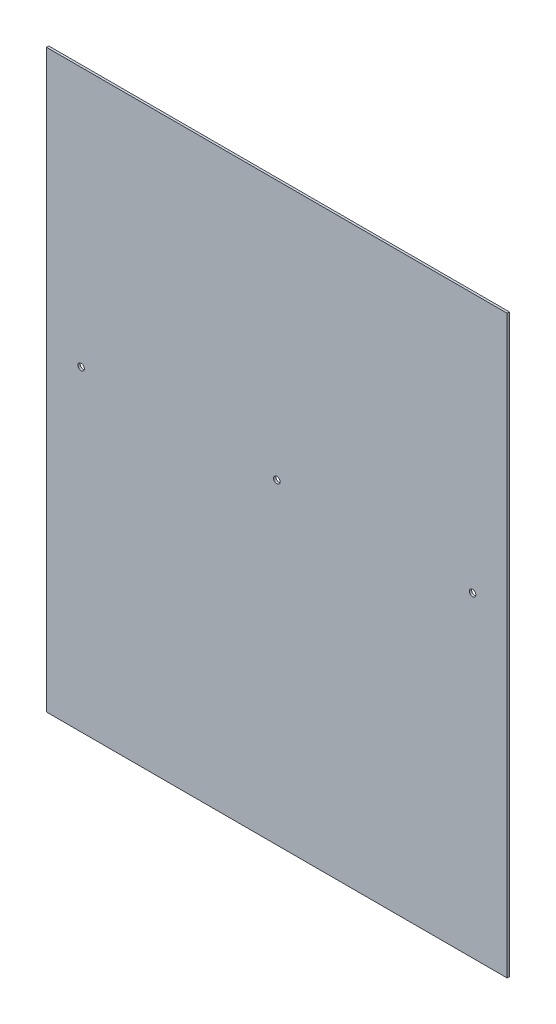
ISO-10303-21;
HEADER;
FILE_DESCRIPTION(('STEP AP214'),'2;1');
FILE_NAME('part.step','',(''),(''),'','','');
FILE_SCHEMA(('AUTOMOTIVE_DESIGN { 1 0 10303 214 1 1 1 1 }'));
ENDSEC;
DATA;
#1=APPLICATION_CONTEXT('core data for automotive mechanical design processes');
#2=APPLICATION_PROTOCOL_DEFINITION('international standard','automotive_design',2000,#1);
#3=PRODUCT_CONTEXT('',#1,'mechanical');
#4=PRODUCT('Part','Part','',(#3));
#5=PRODUCT_RELATED_PRODUCT_CATEGORY('part','',(#4));
#6=PRODUCT_DEFINITION_FORMATION('','',#4);
#7=PRODUCT_DEFINITION_CONTEXT('part definition',#1,'design');
#8=PRODUCT_DEFINITION('design','',#6,#7);
#9=PRODUCT_DEFINITION_SHAPE('','',#8);
#10=(LENGTH_UNIT() NAMED_UNIT(*) SI_UNIT(.MILLI.,.METRE.));
#11=(NAMED_UNIT(*) PLANE_ANGLE_UNIT() SI_UNIT($,.RADIAN.));
#12=(NAMED_UNIT(*) SI_UNIT($,.STERADIAN.) SOLID_ANGLE_UNIT());
#13=UNCERTAINTY_MEASURE_WITH_UNIT(LENGTH_MEASURE(1.E-05),#10,'distance_accuracy_value','');
#14=(GEOMETRIC_REPRESENTATION_CONTEXT(3) GLOBAL_UNCERTAINTY_ASSIGNED_CONTEXT((#13)) GLOBAL_UNIT_ASSIGNED_CONTEXT((#10,
#11,#12)) REPRESENTATION_CONTEXT('',''));
#15=CARTESIAN_POINT('',(0.,0.,0.));
#16=DIRECTION('',(0.,0.,1.));
#17=DIRECTION('',(1.,0.,0.));
#18=AXIS2_PLACEMENT_3D('',#15,#16,#17);
#19=CARTESIAN_POINT('',(200.,250.,2.));
#20=DIRECTION('',(-1.,0.,0.));
#21=DIRECTION('',(0.,-1.,0.));
#22=AXIS2_PLACEMENT_3D('',#19,#20,#21);
#23=PLANE('',#22);
#24=DIRECTION('',(0.,1.,0.));
#25=VECTOR('',#24,1.);
#26=CARTESIAN_POINT('',(200.,250.,0.));
#27=LINE('',#26,#25);
#28=CARTESIAN_POINT('',(200.,-250.,0.));
#29=VERTEX_POINT('',#28);
#30=CARTESIAN_POINT('',(200.,250.,0.));
#31=VERTEX_POINT('',#30);
#32=EDGE_CURVE('E103',#29,#31,#27,.T.);
#33=ORIENTED_EDGE('',*,*,#32,.T.);
#34=DIRECTION('',(0.,0.,-1.));
#35=VECTOR('',#34,1.);
#36=CARTESIAN_POINT('',(200.,250.,2.));
#37=LINE('',#36,#35);
#38=CARTESIAN_POINT('',(200.,250.,2.));
#39=VERTEX_POINT('',#38);
#40=EDGE_CURVE('E11',#39,#31,#37,.T.);
#41=ORIENTED_EDGE('',*,*,#40,.F.);
#42=DIRECTION('',(0.,1.,0.));
#43=VECTOR('',#42,1.);
#44=CARTESIAN_POINT('',(200.,250.,2.));
#45=LINE('',#44,#43);
#46=CARTESIAN_POINT('',(200.,-250.,2.));
#47=VERTEX_POINT('',#46);
#48=EDGE_CURVE('E90',#47,#39,#45,.T.);
#49=ORIENTED_EDGE('',*,*,#48,.F.);
#50=DIRECTION('',(0.,0.,-1.));
#51=VECTOR('',#50,1.);
#52=CARTESIAN_POINT('',(200.,-250.,2.));
#53=LINE('',#52,#51);
#54=EDGE_CURVE('E99',#47,#29,#53,.T.);
#55=ORIENTED_EDGE('',*,*,#54,.T.);
#56=EDGE_LOOP('',(#33,#41,#49,#55));
#57=FACE_BOUND('',#56,.T.);
#58=ADVANCED_FACE('F37',(#57),#23,.F.);
#59=CARTESIAN_POINT('',(-200.,250.,2.));
#60=DIRECTION('',(0.,-1.,0.));
#61=DIRECTION('',(0.,0.,-1.));
#62=AXIS2_PLACEMENT_3D('',#59,#60,#61);
#63=PLANE('',#62);
#64=DIRECTION('',(-1.,0.,0.));
#65=VECTOR('',#64,1.);
#66=CARTESIAN_POINT('',(-200.,250.,0.));
#67=LINE('',#66,#65);
#68=CARTESIAN_POINT('',(-200.,250.,0.));
#69=VERTEX_POINT('',#68);
#70=EDGE_CURVE('E94',#31,#69,#67,.T.);
#71=ORIENTED_EDGE('',*,*,#70,.T.);
#72=DIRECTION('',(0.,0.,-1.));
#73=VECTOR('',#72,1.);
#74=CARTESIAN_POINT('',(-200.,250.,2.));
#75=LINE('',#74,#73);
#76=CARTESIAN_POINT('',(-200.,250.,2.));
#77=VERTEX_POINT('',#76);
#78=EDGE_CURVE('E46',#77,#69,#75,.T.);
#79=ORIENTED_EDGE('',*,*,#78,.F.);
#80=DIRECTION('',(-1.,0.,0.));
#81=VECTOR('',#80,1.);
#82=CARTESIAN_POINT('',(-200.,250.,2.));
#83=LINE('',#82,#81);
#84=EDGE_CURVE('E85',#39,#77,#83,.T.);
#85=ORIENTED_EDGE('',*,*,#84,.F.);
#86=ORIENTED_EDGE('',*,*,#40,.T.);
#87=EDGE_LOOP('',(#71,#79,#85,#86));
#88=FACE_BOUND('',#87,.T.);
#89=ADVANCED_FACE('F93',(#88),#63,.F.);
#90=CARTESIAN_POINT('',(-200.,250.,2.));
#91=DIRECTION('',(1.,0.,0.));
#92=DIRECTION('',(0.,1.,0.));
#93=AXIS2_PLACEMENT_3D('',#90,#91,#92);
#94=PLANE('',#93);
#95=DIRECTION('',(0.,-1.,0.));
#96=VECTOR('',#95,1.);
#97=CARTESIAN_POINT('',(-200.,250.,0.));
#98=LINE('',#97,#96);
#99=CARTESIAN_POINT('',(-200.,-250.,0.));
#100=VERTEX_POINT('',#99);
#101=EDGE_CURVE('E72',#69,#100,#98,.T.);
#102=ORIENTED_EDGE('',*,*,#101,.T.);
#103=DIRECTION('',(0.,0.,-1.));
#104=VECTOR('',#103,1.);
#105=CARTESIAN_POINT('',(-200.,-250.,2.));
#106=LINE('',#105,#104);
#107=CARTESIAN_POINT('',(-200.,-250.,2.));
#108=VERTEX_POINT('',#107);
#109=EDGE_CURVE('E95',#108,#100,#106,.T.);
#110=ORIENTED_EDGE('',*,*,#109,.F.);
#111=DIRECTION('',(0.,-1.,0.));
#112=VECTOR('',#111,1.);
#113=CARTESIAN_POINT('',(-200.,250.,2.));
#114=LINE('',#113,#112);
#115=EDGE_CURVE('E88',#77,#108,#114,.T.);
#116=ORIENTED_EDGE('',*,*,#115,.F.);
#117=ORIENTED_EDGE('',*,*,#78,.T.);
#118=EDGE_LOOP('',(#102,#110,#116,#117));
#119=FACE_BOUND('',#118,.T.);
#120=ADVANCED_FACE('F97',(#119),#94,.F.);
#121=CARTESIAN_POINT('',(-200.,-250.,2.));
#122=DIRECTION('',(0.,1.,0.));
#123=DIRECTION('',(0.,0.,1.));
#124=AXIS2_PLACEMENT_3D('',#121,#122,#123);
#125=PLANE('',#124);
#126=DIRECTION('',(1.,0.,0.));
#127=VECTOR('',#126,1.);
#128=CARTESIAN_POINT('',(-200.,-250.,0.));
#129=LINE('',#128,#127);
#130=EDGE_CURVE('E78',#100,#29,#129,.T.);
#131=ORIENTED_EDGE('',*,*,#130,.T.);
#132=ORIENTED_EDGE('',*,*,#54,.F.);
#133=DIRECTION('',(1.,0.,0.));
#134=VECTOR('',#133,1.);
#135=CARTESIAN_POINT('',(-200.,-250.,2.));
#136=LINE('',#135,#134);
#137=EDGE_CURVE('E55',#108,#47,#136,.T.);
#138=ORIENTED_EDGE('',*,*,#137,.F.);
#139=ORIENTED_EDGE('',*,*,#109,.T.);
#140=EDGE_LOOP('',(#131,#132,#138,#139));
#141=FACE_BOUND('',#140,.T.);
#142=ADVANCED_FACE('F145',(#141),#125,.F.);
#143=CARTESIAN_POINT('',(0.,0.,2.));
#144=DIRECTION('',(0.,0.,1.));
#145=DIRECTION('',(1.,0.,0.));
#146=AXIS2_PLACEMENT_3D('',#143,#144,#145);
#147=PLANE('',#146);
#148=CARTESIAN_POINT('',(-170.,24.5418459257838,2.));
#149=DIRECTION('',(0.,0.,1.));
#150=DIRECTION('',(1.,0.,0.));
#151=AXIS2_PLACEMENT_3D('',#148,#149,#150);
#152=CIRCLE('',#151,2.82157287525372);
#153=CARTESIAN_POINT('',(-167.178427124746,24.5418459257838,2.));
#154=VERTEX_POINT('',#153);
#155=EDGE_CURVE('E106',#154,#154,#152,.F.);
#156=ORIENTED_EDGE('',*,*,#155,.T.);
#157=EDGE_LOOP('',(#156));
#158=FACE_BOUND('',#157,.T.);
#159=CARTESIAN_POINT('',(-1.94512107648512E-13,24.5418459257837,2.));
#160=DIRECTION('',(0.,0.,1.));
#161=DIRECTION('',(1.,0.,0.));
#162=AXIS2_PLACEMENT_3D('',#159,#160,#161);
#163=CIRCLE('',#162,2.82157287525375);
#164=CARTESIAN_POINT('',(2.82157287525356,24.5418459257837,2.));
#165=VERTEX_POINT('',#164);
#166=EDGE_CURVE('E117',#165,#165,#163,.F.);
#167=ORIENTED_EDGE('',*,*,#166,.T.);
#168=EDGE_LOOP('',(#167));
#169=FACE_BOUND('',#168,.T.);
#170=CARTESIAN_POINT('',(170.,24.5418459257837,2.));
#171=DIRECTION('',(0.,0.,1.));
#172=DIRECTION('',(1.,0.,0.));
#173=AXIS2_PLACEMENT_3D('',#170,#171,#172);
#174=CIRCLE('',#173,2.82157287525372);
#175=CARTESIAN_POINT('',(172.821572875253,24.5418459257837,2.));
#176=VERTEX_POINT('',#175);
#177=EDGE_CURVE('E114',#176,#176,#174,.F.);
#178=ORIENTED_EDGE('',*,*,#177,.T.);
#179=EDGE_LOOP('',(#178));
#180=FACE_BOUND('',#179,.T.);
#181=ORIENTED_EDGE('',*,*,#48,.T.);
#182=ORIENTED_EDGE('',*,*,#84,.T.);
#183=ORIENTED_EDGE('',*,*,#115,.T.);
#184=ORIENTED_EDGE('',*,*,#137,.T.);
#185=EDGE_LOOP('',(#181,#182,#183,#184));
#186=FACE_BOUND('',#185,.T.);
#187=ADVANCED_FACE('F86',(#158,#169,#180,#186),#147,.T.);
#188=CARTESIAN_POINT('',(0.,0.,0.));
#189=DIRECTION('',(0.,0.,1.));
#190=DIRECTION('',(1.,0.,0.));
#191=AXIS2_PLACEMENT_3D('',#188,#189,#190);
#192=PLANE('',#191);
#193=CARTESIAN_POINT('',(-170.,24.5418459257838,0.));
#194=DIRECTION('',(0.,0.,1.));
#195=DIRECTION('',(1.,0.,0.));
#196=AXIS2_PLACEMENT_3D('',#193,#194,#195);
#197=CIRCLE('',#196,2.82157287525372);
#198=CARTESIAN_POINT('',(-167.178427124746,24.5418459257838,0.));
#199=VERTEX_POINT('',#198);
#200=EDGE_CURVE('E40',#199,#199,#197,.F.);
#201=ORIENTED_EDGE('',*,*,#200,.F.);
#202=EDGE_LOOP('',(#201));
#203=FACE_BOUND('',#202,.T.);
#204=CARTESIAN_POINT('',(-1.94512107648512E-13,24.5418459257837,0.));
#205=DIRECTION('',(0.,0.,1.));
#206=DIRECTION('',(1.,0.,0.));
#207=AXIS2_PLACEMENT_3D('',#204,#205,#206);
#208=CIRCLE('',#207,2.82157287525375);
#209=CARTESIAN_POINT('',(2.82157287525356,24.5418459257837,0.));
#210=VERTEX_POINT('',#209);
#211=EDGE_CURVE('E115',#210,#210,#208,.F.);
#212=ORIENTED_EDGE('',*,*,#211,.F.);
#213=EDGE_LOOP('',(#212));
#214=FACE_BOUND('',#213,.T.);
#215=CARTESIAN_POINT('',(170.,24.5418459257837,0.));
#216=DIRECTION('',(0.,0.,1.));
#217=DIRECTION('',(1.,0.,0.));
#218=AXIS2_PLACEMENT_3D('',#215,#216,#217);
#219=CIRCLE('',#218,2.82157287525372);
#220=CARTESIAN_POINT('',(172.821572875253,24.5418459257837,0.));
#221=VERTEX_POINT('',#220);
#222=EDGE_CURVE('E112',#221,#221,#219,.F.);
#223=ORIENTED_EDGE('',*,*,#222,.F.);
#224=EDGE_LOOP('',(#223));
#225=FACE_BOUND('',#224,.T.);
#226=ORIENTED_EDGE('',*,*,#32,.F.);
#227=ORIENTED_EDGE('',*,*,#130,.F.);
#228=ORIENTED_EDGE('',*,*,#101,.F.);
#229=ORIENTED_EDGE('',*,*,#70,.F.);
#230=EDGE_LOOP('',(#226,#227,#228,#229));
#231=FACE_BOUND('',#230,.T.);
#232=ADVANCED_FACE('F135',(#203,#214,#225,#231),#192,.F.);
#233=CARTESIAN_POINT('',(170.,24.5418459257837,-26.0000000000001));
#234=DIRECTION('',(0.,0.,1.));
#235=DIRECTION('',(1.,0.,0.));
#236=AXIS2_PLACEMENT_3D('',#233,#234,#235);
#237=CYLINDRICAL_SURFACE('',#236,2.82157287525372);
#238=CARTESIAN_POINT('',(172.821572875253,24.5418459257837,2.));
#239=CARTESIAN_POINT('',(172.821572875253,24.5418459257837,1.97916666666667));
#240=CARTESIAN_POINT('',(172.821572875253,24.5418459257837,1.95833333333333));
#241=CARTESIAN_POINT('',(172.821572875253,24.5418459257837,1.91666666666666));
#242=CARTESIAN_POINT('',(172.821572875253,24.5418459257837,1.89583333333333));
#243=CARTESIAN_POINT('',(172.821572875253,24.5418459257837,1.85416666666666));
#244=CARTESIAN_POINT('',(172.821572875253,24.5418459257837,1.83333333333333));
#245=CARTESIAN_POINT('',(172.821572875253,24.5418459257837,1.79166666666666));
#246=CARTESIAN_POINT('',(172.821572875253,24.5418459257837,1.77083333333333));
#247=CARTESIAN_POINT('',(172.821572875253,24.5418459257837,1.72916666666666));
#248=CARTESIAN_POINT('',(172.821572875253,24.5418459257837,1.70833333333333));
#249=CARTESIAN_POINT('',(172.821572875253,24.5418459257837,1.66666666666666));
#250=CARTESIAN_POINT('',(172.821572875253,24.5418459257837,1.64583333333333));
#251=CARTESIAN_POINT('',(172.821572875253,24.5418459257837,1.60416666666666));
#252=CARTESIAN_POINT('',(172.821572875253,24.5418459257837,1.58333333333333));
#253=CARTESIAN_POINT('',(172.821572875253,24.5418459257837,1.54166666666666));
#254=CARTESIAN_POINT('',(172.821572875253,24.5418459257837,1.52083333333333));
#255=CARTESIAN_POINT('',(172.821572875253,24.5418459257837,1.47916666666666));
#256=CARTESIAN_POINT('',(172.821572875253,24.5418459257837,1.45833333333333));
#257=CARTESIAN_POINT('',(172.821572875253,24.5418459257837,1.41666666666666));
#258=CARTESIAN_POINT('',(172.821572875253,24.5418459257837,1.39583333333333));
#259=CARTESIAN_POINT('',(172.821572875253,24.5418459257837,1.35416666666666));
#260=CARTESIAN_POINT('',(172.821572875253,24.5418459257837,1.33333333333333));
#261=CARTESIAN_POINT('',(172.821572875253,24.5418459257837,1.29166666666666));
#262=CARTESIAN_POINT('',(172.821572875253,24.5418459257837,1.27083333333333));
#263=CARTESIAN_POINT('',(172.821572875253,24.5418459257837,1.22916666666666));
#264=CARTESIAN_POINT('',(172.821572875253,24.5418459257837,1.20833333333333));
#265=CARTESIAN_POINT('',(172.821572875253,24.5418459257837,1.16666666666666));
#266=CARTESIAN_POINT('',(172.821572875253,24.5418459257837,1.14583333333333));
#267=CARTESIAN_POINT('',(172.821572875253,24.5418459257837,1.10416666666666));
#268=CARTESIAN_POINT('',(172.821572875253,24.5418459257837,1.08333333333333));
#269=CARTESIAN_POINT('',(172.821572875253,24.5418459257837,1.04166666666666));
#270=CARTESIAN_POINT('',(172.821572875253,24.5418459257837,1.02083333333333));
#271=CARTESIAN_POINT('',(172.821572875253,24.5418459257837,0.979166666666664));
#272=CARTESIAN_POINT('',(172.821572875253,24.5418459257837,0.958333333333331));
#273=CARTESIAN_POINT('',(172.821572875253,24.5418459257837,0.916666666666664));
#274=CARTESIAN_POINT('',(172.821572875253,24.5418459257837,0.895833333333331));
#275=CARTESIAN_POINT('',(172.821572875253,24.5418459257837,0.854166666666664));
#276=CARTESIAN_POINT('',(172.821572875253,24.5418459257837,0.833333333333331));
#277=CARTESIAN_POINT('',(172.821572875253,24.5418459257837,0.791666666666664));
#278=CARTESIAN_POINT('',(172.821572875253,24.5418459257837,0.77083333333333));
#279=CARTESIAN_POINT('',(172.821572875253,24.5418459257837,0.729166666666664));
#280=CARTESIAN_POINT('',(172.821572875253,24.5418459257837,0.70833333333333));
#281=CARTESIAN_POINT('',(172.821572875253,24.5418459257837,0.666666666666664));
#282=CARTESIAN_POINT('',(172.821572875253,24.5418459257837,0.64583333333333));
#283=CARTESIAN_POINT('',(172.821572875253,24.5418459257837,0.604166666666664));
#284=CARTESIAN_POINT('',(172.821572875253,24.5418459257837,0.58333333333333));
#285=CARTESIAN_POINT('',(172.821572875253,24.5418459257837,0.541666666666664));
#286=CARTESIAN_POINT('',(172.821572875253,24.5418459257837,0.52083333333333));
#287=CARTESIAN_POINT('',(172.821572875253,24.5418459257837,0.479166666666664));
#288=CARTESIAN_POINT('',(172.821572875253,24.5418459257837,0.45833333333333));
#289=CARTESIAN_POINT('',(172.821572875253,24.5418459257837,0.416666666666664));
#290=CARTESIAN_POINT('',(172.821572875253,24.5418459257837,0.39583333333333));
#291=CARTESIAN_POINT('',(172.821572875253,24.5418459257837,0.354166666666664));
#292=CARTESIAN_POINT('',(172.821572875253,24.5418459257837,0.33333333333333));
#293=CARTESIAN_POINT('',(172.821572875253,24.5418459257837,0.291666666666663));
#294=CARTESIAN_POINT('',(172.821572875253,24.5418459257837,0.27083333333333));
#295=CARTESIAN_POINT('',(172.821572875253,24.5418459257837,0.229166666666663));
#296=CARTESIAN_POINT('',(172.821572875253,24.5418459257837,0.20833333333333));
#297=CARTESIAN_POINT('',(172.821572875253,24.5418459257837,0.166666666666663));
#298=CARTESIAN_POINT('',(172.821572875253,24.5418459257837,0.14583333333333));
#299=CARTESIAN_POINT('',(172.821572875253,24.5418459257837,0.104166666666663));
#300=CARTESIAN_POINT('',(172.821572875253,24.5418459257837,0.0833333333333299));
#301=CARTESIAN_POINT('',(172.821572875253,24.5418459257837,0.0416666666666632));
#302=CARTESIAN_POINT('',(172.821572875253,24.5418459257837,0.0208333333333299));
#303=CARTESIAN_POINT('',(172.821572875253,24.5418459257837,0.));
#304=B_SPLINE_CURVE_WITH_KNOTS('',3,(#238,#239,#240,#241,#242,#243,#244,#245,#246,#247,#248,
#249,#250,#251,#252,#253,#254,#255,#256,#257,#258,#259,#260,#261,#262,#263,#264,#265,#266,#267,
#268,#269,#270,#271,#272,#273,#274,#275,#276,#277,#278,#279,#280,#281,#282,#283,#284,#285,#286,
#287,#288,#289,#290,#291,#292,#293,#294,#295,#296,#297,#298,#299,#300,#301,#302,#303),
.UNSPECIFIED.,.F.,.F.,(4,2,2,2,2,2,2,2,2,2,2,2,2,2,2,2,2,2,2,2,2,2,2,2,2,2,2,2,2,2,2,2,4),(0.,
0.0625000000000001,0.125,0.1875,0.25,0.3125,0.375,0.4375,0.5,0.5625,0.625000000000001,
0.687500000000001,0.750000000000001,0.812500000000001,0.875000000000001,0.937500000000001,1.,
1.0625,1.125,1.1875,1.25,1.3125,1.375,1.4375,1.5,1.5625,1.625,1.6875,1.75,1.8125,1.875,1.9375,
2.),.UNSPECIFIED.);
#305=EDGE_CURVE('BSEAM138',#176,#221,#304,.T.);
#306=ORIENTED_EDGE('',*,*,#177,.F.);
#307=ORIENTED_EDGE('',*,*,#222,.T.);
#308=ORIENTED_EDGE('',*,*,#305,.T.);
#309=ORIENTED_EDGE('',*,*,#305,.F.);
#310=EDGE_LOOP('',(#306,#308,#307,#309));
#311=FACE_BOUND('',#310,.T.);
#312=ADVANCED_FACE('F138',(#311),#237,.F.);
#313=CARTESIAN_POINT('',(-1.94512107648512E-13,24.5418459257837,-26.0000000000001));
#314=DIRECTION('',(0.,0.,1.));
#315=DIRECTION('',(1.,0.,0.));
#316=AXIS2_PLACEMENT_3D('',#313,#314,#315);
#317=CYLINDRICAL_SURFACE('',#316,2.82157287525375);
#318=CARTESIAN_POINT('',(2.82157287525356,24.5418459257837,2.));
#319=CARTESIAN_POINT('',(2.82157287525356,24.5418459257837,1.97916666666667));
#320=CARTESIAN_POINT('',(2.82157287525356,24.5418459257837,1.95833333333333));
#321=CARTESIAN_POINT('',(2.82157287525356,24.5418459257837,1.91666666666666));
#322=CARTESIAN_POINT('',(2.82157287525356,24.5418459257837,1.89583333333333));
#323=CARTESIAN_POINT('',(2.82157287525356,24.5418459257837,1.85416666666666));
#324=CARTESIAN_POINT('',(2.82157287525356,24.5418459257837,1.83333333333333));
#325=CARTESIAN_POINT('',(2.82157287525356,24.5418459257837,1.79166666666666));
#326=CARTESIAN_POINT('',(2.82157287525356,24.5418459257837,1.77083333333333));
#327=CARTESIAN_POINT('',(2.82157287525356,24.5418459257837,1.72916666666666));
#328=CARTESIAN_POINT('',(2.82157287525356,24.5418459257837,1.70833333333333));
#329=CARTESIAN_POINT('',(2.82157287525356,24.5418459257837,1.66666666666666));
#330=CARTESIAN_POINT('',(2.82157287525356,24.5418459257837,1.64583333333333));
#331=CARTESIAN_POINT('',(2.82157287525356,24.5418459257837,1.60416666666666));
#332=CARTESIAN_POINT('',(2.82157287525356,24.5418459257837,1.58333333333333));
#333=CARTESIAN_POINT('',(2.82157287525356,24.5418459257837,1.54166666666666));
#334=CARTESIAN_POINT('',(2.82157287525356,24.5418459257837,1.52083333333333));
#335=CARTESIAN_POINT('',(2.82157287525356,24.5418459257837,1.47916666666666));
#336=CARTESIAN_POINT('',(2.82157287525356,24.5418459257837,1.45833333333333));
#337=CARTESIAN_POINT('',(2.82157287525356,24.5418459257837,1.41666666666666));
#338=CARTESIAN_POINT('',(2.82157287525356,24.5418459257837,1.39583333333333));
#339=CARTESIAN_POINT('',(2.82157287525356,24.5418459257837,1.35416666666666));
#340=CARTESIAN_POINT('',(2.82157287525356,24.5418459257837,1.33333333333333));
#341=CARTESIAN_POINT('',(2.82157287525356,24.5418459257837,1.29166666666666));
#342=CARTESIAN_POINT('',(2.82157287525356,24.5418459257837,1.27083333333333));
#343=CARTESIAN_POINT('',(2.82157287525356,24.5418459257837,1.22916666666666));
#344=CARTESIAN_POINT('',(2.82157287525356,24.5418459257837,1.20833333333333));
#345=CARTESIAN_POINT('',(2.82157287525356,24.5418459257837,1.16666666666666));
#346=CARTESIAN_POINT('',(2.82157287525356,24.5418459257837,1.14583333333333));
#347=CARTESIAN_POINT('',(2.82157287525356,24.5418459257837,1.10416666666666));
#348=CARTESIAN_POINT('',(2.82157287525356,24.5418459257837,1.08333333333333));
#349=CARTESIAN_POINT('',(2.82157287525356,24.5418459257837,1.04166666666666));
#350=CARTESIAN_POINT('',(2.82157287525356,24.5418459257837,1.02083333333333));
#351=CARTESIAN_POINT('',(2.82157287525356,24.5418459257837,0.979166666666664));
#352=CARTESIAN_POINT('',(2.82157287525356,24.5418459257837,0.958333333333331));
#353=CARTESIAN_POINT('',(2.82157287525356,24.5418459257837,0.916666666666664));
#354=CARTESIAN_POINT('',(2.82157287525356,24.5418459257837,0.895833333333331));
#355=CARTESIAN_POINT('',(2.82157287525356,24.5418459257837,0.854166666666664));
#356=CARTESIAN_POINT('',(2.82157287525356,24.5418459257837,0.833333333333331));
#357=CARTESIAN_POINT('',(2.82157287525356,24.5418459257837,0.791666666666664));
#358=CARTESIAN_POINT('',(2.82157287525356,24.5418459257837,0.77083333333333));
#359=CARTESIAN_POINT('',(2.82157287525356,24.5418459257837,0.729166666666664));
#360=CARTESIAN_POINT('',(2.82157287525356,24.5418459257837,0.70833333333333));
#361=CARTESIAN_POINT('',(2.82157287525356,24.5418459257837,0.666666666666664));
#362=CARTESIAN_POINT('',(2.82157287525356,24.5418459257837,0.64583333333333));
#363=CARTESIAN_POINT('',(2.82157287525356,24.5418459257837,0.604166666666664));
#364=CARTESIAN_POINT('',(2.82157287525356,24.5418459257837,0.58333333333333));
#365=CARTESIAN_POINT('',(2.82157287525356,24.5418459257837,0.541666666666664));
#366=CARTESIAN_POINT('',(2.82157287525356,24.5418459257837,0.52083333333333));
#367=CARTESIAN_POINT('',(2.82157287525356,24.5418459257837,0.479166666666664));
#368=CARTESIAN_POINT('',(2.82157287525356,24.5418459257837,0.45833333333333));
#369=CARTESIAN_POINT('',(2.82157287525356,24.5418459257837,0.416666666666664));
#370=CARTESIAN_POINT('',(2.82157287525356,24.5418459257837,0.39583333333333));
#371=CARTESIAN_POINT('',(2.82157287525356,24.5418459257837,0.354166666666664));
#372=CARTESIAN_POINT('',(2.82157287525356,24.5418459257837,0.33333333333333));
#373=CARTESIAN_POINT('',(2.82157287525356,24.5418459257837,0.291666666666663));
#374=CARTESIAN_POINT('',(2.82157287525356,24.5418459257837,0.27083333333333));
#375=CARTESIAN_POINT('',(2.82157287525356,24.5418459257837,0.229166666666663));
#376=CARTESIAN_POINT('',(2.82157287525356,24.5418459257837,0.20833333333333));
#377=CARTESIAN_POINT('',(2.82157287525356,24.5418459257837,0.166666666666663));
#378=CARTESIAN_POINT('',(2.82157287525356,24.5418459257837,0.14583333333333));
#379=CARTESIAN_POINT('',(2.82157287525356,24.5418459257837,0.104166666666663));
#380=CARTESIAN_POINT('',(2.82157287525356,24.5418459257837,0.0833333333333299));
#381=CARTESIAN_POINT('',(2.82157287525356,24.5418459257837,0.0416666666666632));
#382=CARTESIAN_POINT('',(2.82157287525356,24.5418459257837,0.0208333333333299));
#383=CARTESIAN_POINT('',(2.82157287525356,24.5418459257837,0.));
#384=B_SPLINE_CURVE_WITH_KNOTS('',3,(#318,#319,#320,#321,#322,#323,#324,#325,#326,#327,#328,
#329,#330,#331,#332,#333,#334,#335,#336,#337,#338,#339,#340,#341,#342,#343,#344,#345,#346,#347,
#348,#349,#350,#351,#352,#353,#354,#355,#356,#357,#358,#359,#360,#361,#362,#363,#364,#365,#366,
#367,#368,#369,#370,#371,#372,#373,#374,#375,#376,#377,#378,#379,#380,#381,#382,#383),
.UNSPECIFIED.,.F.,.F.,(4,2,2,2,2,2,2,2,2,2,2,2,2,2,2,2,2,2,2,2,2,2,2,2,2,2,2,2,2,2,2,2,4),(0.,
0.0625000000000001,0.125,0.1875,0.25,0.3125,0.375,0.4375,0.5,0.5625,0.625000000000001,
0.687500000000001,0.750000000000001,0.812500000000001,0.875000000000001,0.937500000000001,1.,
1.0625,1.125,1.1875,1.25,1.3125,1.375,1.4375,1.5,1.5625,1.625,1.6875,1.75,1.8125,1.875,1.9375,
2.),.UNSPECIFIED.);
#385=EDGE_CURVE('BSEAM190',#165,#210,#384,.T.);
#386=ORIENTED_EDGE('',*,*,#166,.F.);
#387=ORIENTED_EDGE('',*,*,#211,.T.);
#388=ORIENTED_EDGE('',*,*,#385,.T.);
#389=ORIENTED_EDGE('',*,*,#385,.F.);
#390=EDGE_LOOP('',(#386,#388,#387,#389));
#391=FACE_BOUND('',#390,.T.);
#392=ADVANCED_FACE('F190',(#391),#317,.F.);
#393=CARTESIAN_POINT('',(-170.,24.5418459257838,-26.0000000000001));
#394=DIRECTION('',(0.,0.,1.));
#395=DIRECTION('',(1.,0.,0.));
#396=AXIS2_PLACEMENT_3D('',#393,#394,#395);
#397=CYLINDRICAL_SURFACE('',#396,2.82157287525372);
#398=CARTESIAN_POINT('',(-167.178427124746,24.5418459257838,2.));
#399=CARTESIAN_POINT('',(-167.178427124746,24.5418459257838,1.97916666666667));
#400=CARTESIAN_POINT('',(-167.178427124746,24.5418459257838,1.95833333333333));
#401=CARTESIAN_POINT('',(-167.178427124746,24.5418459257838,1.91666666666666));
#402=CARTESIAN_POINT('',(-167.178427124746,24.5418459257838,1.89583333333333));
#403=CARTESIAN_POINT('',(-167.178427124746,24.5418459257838,1.85416666666666));
#404=CARTESIAN_POINT('',(-167.178427124746,24.5418459257838,1.83333333333333));
#405=CARTESIAN_POINT('',(-167.178427124746,24.5418459257838,1.79166666666666));
#406=CARTESIAN_POINT('',(-167.178427124746,24.5418459257838,1.77083333333333));
#407=CARTESIAN_POINT('',(-167.178427124746,24.5418459257838,1.72916666666666));
#408=CARTESIAN_POINT('',(-167.178427124746,24.5418459257838,1.70833333333333));
#409=CARTESIAN_POINT('',(-167.178427124746,24.5418459257838,1.66666666666666));
#410=CARTESIAN_POINT('',(-167.178427124746,24.5418459257838,1.64583333333333));
#411=CARTESIAN_POINT('',(-167.178427124746,24.5418459257838,1.60416666666666));
#412=CARTESIAN_POINT('',(-167.178427124746,24.5418459257838,1.58333333333333));
#413=CARTESIAN_POINT('',(-167.178427124746,24.5418459257838,1.54166666666666));
#414=CARTESIAN_POINT('',(-167.178427124746,24.5418459257838,1.52083333333333));
#415=CARTESIAN_POINT('',(-167.178427124746,24.5418459257838,1.47916666666666));
#416=CARTESIAN_POINT('',(-167.178427124746,24.5418459257838,1.45833333333333));
#417=CARTESIAN_POINT('',(-167.178427124746,24.5418459257838,1.41666666666666));
#418=CARTESIAN_POINT('',(-167.178427124746,24.5418459257838,1.39583333333333));
#419=CARTESIAN_POINT('',(-167.178427124746,24.5418459257838,1.35416666666666));
#420=CARTESIAN_POINT('',(-167.178427124746,24.5418459257838,1.33333333333333));
#421=CARTESIAN_POINT('',(-167.178427124746,24.5418459257838,1.29166666666666));
#422=CARTESIAN_POINT('',(-167.178427124746,24.5418459257838,1.27083333333333));
#423=CARTESIAN_POINT('',(-167.178427124746,24.5418459257838,1.22916666666666));
#424=CARTESIAN_POINT('',(-167.178427124746,24.5418459257838,1.20833333333333));
#425=CARTESIAN_POINT('',(-167.178427124746,24.5418459257838,1.16666666666666));
#426=CARTESIAN_POINT('',(-167.178427124746,24.5418459257838,1.14583333333333));
#427=CARTESIAN_POINT('',(-167.178427124746,24.5418459257838,1.10416666666666));
#428=CARTESIAN_POINT('',(-167.178427124746,24.5418459257838,1.08333333333333));
#429=CARTESIAN_POINT('',(-167.178427124746,24.5418459257838,1.04166666666666));
#430=CARTESIAN_POINT('',(-167.178427124746,24.5418459257838,1.02083333333333));
#431=CARTESIAN_POINT('',(-167.178427124746,24.5418459257838,0.979166666666664));
#432=CARTESIAN_POINT('',(-167.178427124746,24.5418459257838,0.958333333333331));
#433=CARTESIAN_POINT('',(-167.178427124746,24.5418459257838,0.916666666666664));
#434=CARTESIAN_POINT('',(-167.178427124746,24.5418459257838,0.895833333333331));
#435=CARTESIAN_POINT('',(-167.178427124746,24.5418459257838,0.854166666666664));
#436=CARTESIAN_POINT('',(-167.178427124746,24.5418459257838,0.833333333333331));
#437=CARTESIAN_POINT('',(-167.178427124746,24.5418459257838,0.791666666666664));
#438=CARTESIAN_POINT('',(-167.178427124746,24.5418459257838,0.77083333333333));
#439=CARTESIAN_POINT('',(-167.178427124746,24.5418459257838,0.729166666666664));
#440=CARTESIAN_POINT('',(-167.178427124746,24.5418459257838,0.70833333333333));
#441=CARTESIAN_POINT('',(-167.178427124746,24.5418459257838,0.666666666666664));
#442=CARTESIAN_POINT('',(-167.178427124746,24.5418459257838,0.64583333333333));
#443=CARTESIAN_POINT('',(-167.178427124746,24.5418459257838,0.604166666666664));
#444=CARTESIAN_POINT('',(-167.178427124746,24.5418459257838,0.58333333333333));
#445=CARTESIAN_POINT('',(-167.178427124746,24.5418459257838,0.541666666666664));
#446=CARTESIAN_POINT('',(-167.178427124746,24.5418459257838,0.52083333333333));
#447=CARTESIAN_POINT('',(-167.178427124746,24.5418459257838,0.479166666666664));
#448=CARTESIAN_POINT('',(-167.178427124746,24.5418459257838,0.45833333333333));
#449=CARTESIAN_POINT('',(-167.178427124746,24.5418459257838,0.416666666666664));
#450=CARTESIAN_POINT('',(-167.178427124746,24.5418459257838,0.39583333333333));
#451=CARTESIAN_POINT('',(-167.178427124746,24.5418459257838,0.354166666666664));
#452=CARTESIAN_POINT('',(-167.178427124746,24.5418459257838,0.33333333333333));
#453=CARTESIAN_POINT('',(-167.178427124746,24.5418459257838,0.291666666666663));
#454=CARTESIAN_POINT('',(-167.178427124746,24.5418459257838,0.27083333333333));
#455=CARTESIAN_POINT('',(-167.178427124746,24.5418459257838,0.229166666666663));
#456=CARTESIAN_POINT('',(-167.178427124746,24.5418459257838,0.20833333333333));
#457=CARTESIAN_POINT('',(-167.178427124746,24.5418459257838,0.166666666666663));
#458=CARTESIAN_POINT('',(-167.178427124746,24.5418459257838,0.14583333333333));
#459=CARTESIAN_POINT('',(-167.178427124746,24.5418459257838,0.104166666666663));
#460=CARTESIAN_POINT('',(-167.178427124746,24.5418459257838,0.0833333333333299));
#461=CARTESIAN_POINT('',(-167.178427124746,24.5418459257838,0.0416666666666632));
#462=CARTESIAN_POINT('',(-167.178427124746,24.5418459257838,0.0208333333333299));
#463=CARTESIAN_POINT('',(-167.178427124746,24.5418459257838,0.));
#464=B_SPLINE_CURVE_WITH_KNOTS('',3,(#398,#399,#400,#401,#402,#403,#404,#405,#406,#407,#408,
#409,#410,#411,#412,#413,#414,#415,#416,#417,#418,#419,#420,#421,#422,#423,#424,#425,#426,#427,
#428,#429,#430,#431,#432,#433,#434,#435,#436,#437,#438,#439,#440,#441,#442,#443,#444,#445,#446,
#447,#448,#449,#450,#451,#452,#453,#454,#455,#456,#457,#458,#459,#460,#461,#462,#463),
.UNSPECIFIED.,.F.,.F.,(4,2,2,2,2,2,2,2,2,2,2,2,2,2,2,2,2,2,2,2,2,2,2,2,2,2,2,2,2,2,2,2,4),(0.,
0.0625000000000001,0.125,0.1875,0.25,0.3125,0.375,0.4375,0.5,0.5625,0.625000000000001,
0.687500000000001,0.750000000000001,0.812500000000001,0.875000000000001,0.937500000000001,1.,
1.0625,1.125,1.1875,1.25,1.3125,1.375,1.4375,1.5,1.5625,1.625,1.6875,1.75,1.8125,1.875,1.9375,
2.),.UNSPECIFIED.);
#465=EDGE_CURVE('BSEAM133',#154,#199,#464,.T.);
#466=ORIENTED_EDGE('',*,*,#155,.F.);
#467=ORIENTED_EDGE('',*,*,#200,.T.);
#468=ORIENTED_EDGE('',*,*,#465,.T.);
#469=ORIENTED_EDGE('',*,*,#465,.F.);
#470=EDGE_LOOP('',(#466,#468,#467,#469));
#471=FACE_BOUND('',#470,.T.);
#472=ADVANCED_FACE('F133',(#471),#397,.F.);
#473=CLOSED_SHELL('',(#58,#89,#120,#142,#187,#232,#312,#392,#472));
#474=MANIFOLD_SOLID_BREP('B2',#473);
#475=ADVANCED_BREP_SHAPE_REPRESENTATION('',(#18,#474),#14);
#476=SHAPE_DEFINITION_REPRESENTATION(#9,#475);
ENDSEC;
END-ISO-10303-21;
